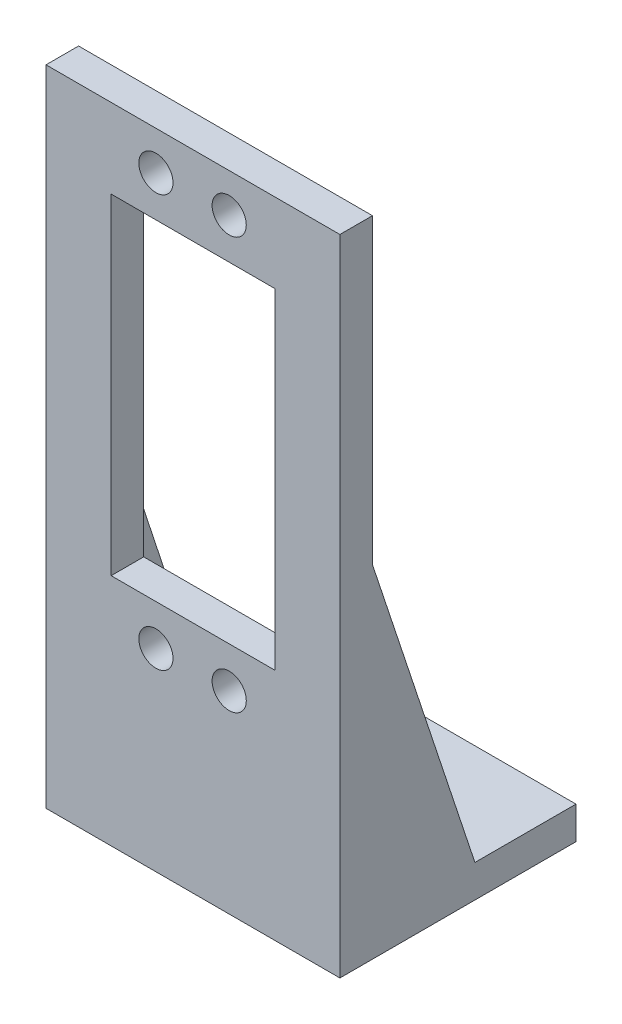
ISO-10303-21;
HEADER;
FILE_DESCRIPTION(('STEP AP214'),'2;1');
FILE_NAME('part.step','',(''),(''),'','','');
FILE_SCHEMA(('AUTOMOTIVE_DESIGN { 1 0 10303 214 1 1 1 1 }'));
ENDSEC;
DATA;
#1=APPLICATION_CONTEXT('core data for automotive mechanical design processes');
#2=APPLICATION_PROTOCOL_DEFINITION('international standard','automotive_design',2000,#1);
#3=PRODUCT_CONTEXT('',#1,'mechanical');
#4=PRODUCT('Part','Part','',(#3));
#5=PRODUCT_RELATED_PRODUCT_CATEGORY('part','',(#4));
#6=PRODUCT_DEFINITION_FORMATION('','',#4);
#7=PRODUCT_DEFINITION_CONTEXT('part definition',#1,'design');
#8=PRODUCT_DEFINITION('design','',#6,#7);
#9=PRODUCT_DEFINITION_SHAPE('','',#8);
#10=(LENGTH_UNIT() NAMED_UNIT(*) SI_UNIT(.MILLI.,.METRE.));
#11=(NAMED_UNIT(*) PLANE_ANGLE_UNIT() SI_UNIT($,.RADIAN.));
#12=(NAMED_UNIT(*) SI_UNIT($,.STERADIAN.) SOLID_ANGLE_UNIT());
#13=UNCERTAINTY_MEASURE_WITH_UNIT(LENGTH_MEASURE(1.E-05),#10,'distance_accuracy_value','');
#14=(GEOMETRIC_REPRESENTATION_CONTEXT(3) GLOBAL_UNCERTAINTY_ASSIGNED_CONTEXT((#13)) GLOBAL_UNIT_ASSIGNED_CONTEXT((#10,
#11,#12)) REPRESENTATION_CONTEXT('',''));
#15=CARTESIAN_POINT('',(0.,0.,0.));
#16=DIRECTION('',(0.,0.,1.));
#17=DIRECTION('',(1.,0.,0.));
#18=AXIS2_PLACEMENT_3D('',#15,#16,#17);
#19=CARTESIAN_POINT('',(0.,0.,4.));
#20=DIRECTION('',(0.,0.,-1.));
#21=DIRECTION('',(-1.,0.,0.));
#22=AXIS2_PLACEMENT_3D('',#19,#20,#21);
#23=PLANE('',#22);
#24=CARTESIAN_POINT('',(2.39999999999999,25.35,4.));
#25=DIRECTION('',(0.,0.,1.));
#26=DIRECTION('',(1.,0.,0.));
#27=AXIS2_PLACEMENT_3D('',#24,#25,#26);
#28=CIRCLE('',#27,2.1);
#29=CARTESIAN_POINT('',(4.49999999999999,25.35,4.));
#30=VERTEX_POINT('',#29);
#31=EDGE_CURVE('E344',#30,#30,#28,.T.);
#32=ORIENTED_EDGE('',*,*,#31,.F.);
#33=EDGE_LOOP('',(#32));
#34=FACE_BOUND('',#33,.T.);
#35=CARTESIAN_POINT('',(-6.60000000000001,-25.25,4.));
#36=DIRECTION('',(0.,0.,1.));
#37=DIRECTION('',(1.,0.,0.));
#38=AXIS2_PLACEMENT_3D('',#35,#36,#37);
#39=CIRCLE('',#38,2.1);
#40=CARTESIAN_POINT('',(-4.50000000000001,-25.25,4.));
#41=VERTEX_POINT('',#40);
#42=EDGE_CURVE('E345',#41,#41,#39,.T.);
#43=ORIENTED_EDGE('',*,*,#42,.F.);
#44=EDGE_LOOP('',(#43));
#45=FACE_BOUND('',#44,.T.);
#46=CARTESIAN_POINT('',(2.39999999999999,-25.25,4.));
#47=DIRECTION('',(0.,0.,1.));
#48=DIRECTION('',(1.,0.,0.));
#49=AXIS2_PLACEMENT_3D('',#46,#47,#48);
#50=CIRCLE('',#49,2.1);
#51=CARTESIAN_POINT('',(4.49999999999999,-25.25,4.));
#52=VERTEX_POINT('',#51);
#53=EDGE_CURVE('E349',#52,#52,#50,.T.);
#54=ORIENTED_EDGE('',*,*,#53,.F.);
#55=EDGE_LOOP('',(#54));
#56=FACE_BOUND('',#55,.T.);
#57=CARTESIAN_POINT('',(-6.60000000000001,25.35,4.));
#58=DIRECTION('',(0.,0.,1.));
#59=DIRECTION('',(1.,0.,0.));
#60=AXIS2_PLACEMENT_3D('',#57,#58,#59);
#61=CIRCLE('',#60,2.1);
#62=CARTESIAN_POINT('',(-4.50000000000001,25.35,4.));
#63=VERTEX_POINT('',#62);
#64=EDGE_CURVE('E291',#63,#63,#61,.T.);
#65=ORIENTED_EDGE('',*,*,#64,.F.);
#66=EDGE_LOOP('',(#65));
#67=FACE_BOUND('',#66,.T.);
#68=DIRECTION('',(0.,1.,0.));
#69=VECTOR('',#68,1.);
#70=CARTESIAN_POINT('',(16.,30.1,4.));
#71=LINE('',#70,#69);
#72=CARTESIAN_POINT('',(16.,-49.,4.));
#73=VERTEX_POINT('',#72);
#74=CARTESIAN_POINT('',(16.,30.1,4.));
#75=VERTEX_POINT('',#74);
#76=EDGE_CURVE('E155',#73,#75,#71,.T.);
#77=ORIENTED_EDGE('',*,*,#76,.T.);
#78=DIRECTION('',(-1.,0.,0.));
#79=VECTOR('',#78,1.);
#80=CARTESIAN_POINT('',(-20.1,30.1,4.));
#81=LINE('',#80,#79);
#82=CARTESIAN_POINT('',(-20.1,30.1,4.));
#83=VERTEX_POINT('',#82);
#84=EDGE_CURVE('E270',#75,#83,#81,.T.);
#85=ORIENTED_EDGE('',*,*,#84,.T.);
#86=DIRECTION('',(0.,-1.,0.));
#87=VECTOR('',#86,1.);
#88=CARTESIAN_POINT('',(-20.1,30.1,4.));
#89=LINE('',#88,#87);
#90=CARTESIAN_POINT('',(-20.1,-49.,4.));
#91=VERTEX_POINT('',#90);
#92=EDGE_CURVE('E273',#83,#91,#89,.T.);
#93=ORIENTED_EDGE('',*,*,#92,.T.);
#94=DIRECTION('',(1.,0.,0.));
#95=VECTOR('',#94,1.);
#96=CARTESIAN_POINT('',(-20.1,-49.,4.));
#97=LINE('',#96,#95);
#98=EDGE_CURVE('E186',#91,#73,#97,.T.);
#99=ORIENTED_EDGE('',*,*,#98,.T.);
#100=EDGE_LOOP('',(#77,#85,#93,#99));
#101=FACE_BOUND('',#100,.T.);
#102=DIRECTION('',(0.,1.,0.));
#103=VECTOR('',#102,1.);
#104=CARTESIAN_POINT('',(7.99999999999999,-20.25,4.));
#105=LINE('',#104,#103);
#106=CARTESIAN_POINT('',(7.99999999999999,-20.25,4.));
#107=VERTEX_POINT('',#106);
#108=CARTESIAN_POINT('',(7.99999999999999,20.35,4.));
#109=VERTEX_POINT('',#108);
#110=EDGE_CURVE('E224',#107,#109,#105,.T.);
#111=ORIENTED_EDGE('',*,*,#110,.F.);
#112=DIRECTION('',(1.,0.,0.));
#113=VECTOR('',#112,1.);
#114=CARTESIAN_POINT('',(-12.1,-20.25,4.));
#115=LINE('',#114,#113);
#116=CARTESIAN_POINT('',(-12.1,-20.25,4.));
#117=VERTEX_POINT('',#116);
#118=EDGE_CURVE('E235',#117,#107,#115,.T.);
#119=ORIENTED_EDGE('',*,*,#118,.F.);
#120=DIRECTION('',(0.,-1.,0.));
#121=VECTOR('',#120,1.);
#122=CARTESIAN_POINT('',(-12.1,-20.25,4.));
#123=LINE('',#122,#121);
#124=CARTESIAN_POINT('',(-12.1,20.35,4.));
#125=VERTEX_POINT('',#124);
#126=EDGE_CURVE('E231',#125,#117,#123,.T.);
#127=ORIENTED_EDGE('',*,*,#126,.F.);
#128=DIRECTION('',(-1.,0.,0.));
#129=VECTOR('',#128,1.);
#130=CARTESIAN_POINT('',(-12.1,20.35,4.));
#131=LINE('',#130,#129);
#132=EDGE_CURVE('E227',#109,#125,#131,.T.);
#133=ORIENTED_EDGE('',*,*,#132,.F.);
#134=EDGE_LOOP('',(#111,#119,#127,#133));
#135=FACE_BOUND('',#134,.T.);
#136=ADVANCED_FACE('F43',(#34,#45,#56,#67,#101,#135),#23,.F.);
#137=CARTESIAN_POINT('',(0.,0.,0.));
#138=DIRECTION('',(0.,0.,-1.));
#139=DIRECTION('',(-1.,0.,0.));
#140=AXIS2_PLACEMENT_3D('',#137,#138,#139);
#141=PLANE('',#140);
#142=CARTESIAN_POINT('',(2.39999999999999,25.35,0.));
#143=DIRECTION('',(0.,0.,-1.));
#144=DIRECTION('',(-1.,0.,0.));
#145=AXIS2_PLACEMENT_3D('',#142,#143,#144);
#146=CIRCLE('',#145,2.1);
#147=CARTESIAN_POINT('',(4.49999999999999,25.35,0.));
#148=VERTEX_POINT('',#147);
#149=EDGE_CURVE('E47',#148,#148,#146,.T.);
#150=ORIENTED_EDGE('',*,*,#149,.F.);
#151=EDGE_LOOP('',(#150));
#152=FACE_BOUND('',#151,.T.);
#153=CARTESIAN_POINT('',(-6.60000000000001,-25.25,0.));
#154=DIRECTION('',(0.,0.,-1.));
#155=DIRECTION('',(-1.,0.,0.));
#156=AXIS2_PLACEMENT_3D('',#153,#154,#155);
#157=CIRCLE('',#156,2.1);
#158=CARTESIAN_POINT('',(-4.50000000000001,-25.25,0.));
#159=VERTEX_POINT('',#158);
#160=EDGE_CURVE('E294',#159,#159,#157,.T.);
#161=ORIENTED_EDGE('',*,*,#160,.F.);
#162=EDGE_LOOP('',(#161));
#163=FACE_BOUND('',#162,.T.);
#164=CARTESIAN_POINT('',(2.39999999999999,-25.25,0.));
#165=DIRECTION('',(0.,0.,-1.));
#166=DIRECTION('',(-1.,0.,0.));
#167=AXIS2_PLACEMENT_3D('',#164,#165,#166);
#168=CIRCLE('',#167,2.1);
#169=CARTESIAN_POINT('',(4.49999999999999,-25.25,0.));
#170=VERTEX_POINT('',#169);
#171=EDGE_CURVE('E290',#170,#170,#168,.T.);
#172=ORIENTED_EDGE('',*,*,#171,.F.);
#173=EDGE_LOOP('',(#172));
#174=FACE_BOUND('',#173,.T.);
#175=CARTESIAN_POINT('',(-6.60000000000001,25.35,0.));
#176=DIRECTION('',(0.,0.,-1.));
#177=DIRECTION('',(-1.,0.,0.));
#178=AXIS2_PLACEMENT_3D('',#175,#176,#177);
#179=CIRCLE('',#178,2.1);
#180=CARTESIAN_POINT('',(-4.50000000000001,25.35,0.));
#181=VERTEX_POINT('',#180);
#182=EDGE_CURVE('E286',#181,#181,#179,.T.);
#183=ORIENTED_EDGE('',*,*,#182,.F.);
#184=EDGE_LOOP('',(#183));
#185=FACE_BOUND('',#184,.T.);
#186=DIRECTION('',(-1.,0.,0.));
#187=VECTOR('',#186,1.);
#188=CARTESIAN_POINT('',(-16.1,-7.00328961607334,0.));
#189=LINE('',#188,#187);
#190=CARTESIAN_POINT('',(-16.1,-7.00328961607334,0.));
#191=VERTEX_POINT('',#190);
#192=CARTESIAN_POINT('',(-20.1,-7.00328961607335,0.));
#193=VERTEX_POINT('',#192);
#194=EDGE_CURVE('E65',#191,#193,#189,.T.);
#195=ORIENTED_EDGE('',*,*,#194,.T.);
#196=DIRECTION('',(0.,-1.,0.));
#197=VECTOR('',#196,1.);
#198=CARTESIAN_POINT('',(-20.1,30.1,0.));
#199=LINE('',#198,#197);
#200=CARTESIAN_POINT('',(-20.1,30.1,0.));
#201=VERTEX_POINT('',#200);
#202=EDGE_CURVE('E156',#201,#193,#199,.T.);
#203=ORIENTED_EDGE('',*,*,#202,.F.);
#204=DIRECTION('',(-1.,0.,0.));
#205=VECTOR('',#204,1.);
#206=CARTESIAN_POINT('',(-20.1,30.1,0.));
#207=LINE('',#206,#205);
#208=CARTESIAN_POINT('',(16.,30.1,0.));
#209=VERTEX_POINT('',#208);
#210=EDGE_CURVE('E278',#209,#201,#207,.T.);
#211=ORIENTED_EDGE('',*,*,#210,.F.);
#212=DIRECTION('',(0.,1.,0.));
#213=VECTOR('',#212,1.);
#214=CARTESIAN_POINT('',(16.,30.1,0.));
#215=LINE('',#214,#213);
#216=CARTESIAN_POINT('',(16.,-7.03160161903525,0.));
#217=VERTEX_POINT('',#216);
#218=EDGE_CURVE('E266',#217,#209,#215,.T.);
#219=ORIENTED_EDGE('',*,*,#218,.F.);
#220=DIRECTION('',(1.,0.,0.));
#221=VECTOR('',#220,1.);
#222=CARTESIAN_POINT('',(12.,-7.03160161903525,0.));
#223=LINE('',#222,#221);
#224=CARTESIAN_POINT('',(12.,-7.03160161903525,0.));
#225=VERTEX_POINT('',#224);
#226=EDGE_CURVE('E170',#225,#217,#223,.T.);
#227=ORIENTED_EDGE('',*,*,#226,.F.);
#228=DIRECTION('',(0.,-1.,0.));
#229=VECTOR('',#228,1.);
#230=CARTESIAN_POINT('',(12.,-7.03160161903525,0.));
#231=LINE('',#230,#229);
#232=CARTESIAN_POINT('',(12.,-45.,0.));
#233=VERTEX_POINT('',#232);
#234=EDGE_CURVE('E161',#225,#233,#231,.T.);
#235=ORIENTED_EDGE('',*,*,#234,.T.);
#236=DIRECTION('',(1.,0.,0.));
#237=VECTOR('',#236,1.);
#238=CARTESIAN_POINT('',(16.,-45.,0.));
#239=LINE('',#238,#237);
#240=CARTESIAN_POINT('',(-16.1,-45.,0.));
#241=VERTEX_POINT('',#240);
#242=EDGE_CURVE('E146',#241,#233,#239,.T.);
#243=ORIENTED_EDGE('',*,*,#242,.F.);
#244=DIRECTION('',(0.,1.,0.));
#245=VECTOR('',#244,1.);
#246=CARTESIAN_POINT('',(-16.1,-7.00328961607334,0.));
#247=LINE('',#246,#245);
#248=EDGE_CURVE('E61',#241,#191,#247,.T.);
#249=ORIENTED_EDGE('',*,*,#248,.T.);
#250=EDGE_LOOP('',(#195,#203,#211,#219,#227,#235,#243,#249));
#251=FACE_BOUND('',#250,.T.);
#252=DIRECTION('',(1.,0.,0.));
#253=VECTOR('',#252,1.);
#254=CARTESIAN_POINT('',(-12.1,-20.25,0.));
#255=LINE('',#254,#253);
#256=CARTESIAN_POINT('',(-12.1,-20.25,0.));
#257=VERTEX_POINT('',#256);
#258=CARTESIAN_POINT('',(7.99999999999999,-20.25,0.));
#259=VERTEX_POINT('',#258);
#260=EDGE_CURVE('E228',#257,#259,#255,.T.);
#261=ORIENTED_EDGE('',*,*,#260,.T.);
#262=DIRECTION('',(0.,1.,0.));
#263=VECTOR('',#262,1.);
#264=CARTESIAN_POINT('',(7.99999999999999,-20.25,0.));
#265=LINE('',#264,#263);
#266=CARTESIAN_POINT('',(7.99999999999999,20.35,0.));
#267=VERTEX_POINT('',#266);
#268=EDGE_CURVE('E212',#259,#267,#265,.T.);
#269=ORIENTED_EDGE('',*,*,#268,.T.);
#270=DIRECTION('',(-1.,0.,0.));
#271=VECTOR('',#270,1.);
#272=CARTESIAN_POINT('',(-12.1,20.35,0.));
#273=LINE('',#272,#271);
#274=CARTESIAN_POINT('',(-12.1,20.35,0.));
#275=VERTEX_POINT('',#274);
#276=EDGE_CURVE('E242',#267,#275,#273,.T.);
#277=ORIENTED_EDGE('',*,*,#276,.T.);
#278=DIRECTION('',(0.,-1.,0.));
#279=VECTOR('',#278,1.);
#280=CARTESIAN_POINT('',(-12.1,-20.25,0.));
#281=LINE('',#280,#279);
#282=EDGE_CURVE('E246',#275,#257,#281,.T.);
#283=ORIENTED_EDGE('',*,*,#282,.T.);
#284=EDGE_LOOP('',(#261,#269,#277,#283));
#285=FACE_BOUND('',#284,.T.);
#286=ADVANCED_FACE('F167',(#152,#163,#174,#185,#251,#285),#141,.T.);
#287=CARTESIAN_POINT('',(16.,30.1,4.));
#288=DIRECTION('',(-1.,0.,0.));
#289=DIRECTION('',(0.,-1.,0.));
#290=AXIS2_PLACEMENT_3D('',#287,#288,#289);
#291=PLANE('',#290);
#292=DIRECTION('',(0.,0.949209959524119,0.314643373901661));
#293=VECTOR('',#292,1.);
#294=CARTESIAN_POINT('',(16.,-7.03160161903525,0.));
#295=LINE('',#294,#293);
#296=CARTESIAN_POINT('',(16.,-45.,-12.5857349560665));
#297=VERTEX_POINT('',#296);
#298=EDGE_CURVE('E172',#297,#217,#295,.T.);
#299=ORIENTED_EDGE('',*,*,#298,.T.);
#300=ORIENTED_EDGE('',*,*,#218,.T.);
#301=DIRECTION('',(0.,0.,-1.));
#302=VECTOR('',#301,1.);
#303=CARTESIAN_POINT('',(16.,30.1,4.));
#304=LINE('',#303,#302);
#305=EDGE_CURVE('E11',#75,#209,#304,.T.);
#306=ORIENTED_EDGE('',*,*,#305,.F.);
#307=ORIENTED_EDGE('',*,*,#76,.F.);
#308=DIRECTION('',(0.,0.,1.));
#309=VECTOR('',#308,1.);
#310=CARTESIAN_POINT('',(16.,-49.,-25.));
#311=LINE('',#310,#309);
#312=CARTESIAN_POINT('',(16.,-49.,-25.));
#313=VERTEX_POINT('',#312);
#314=EDGE_CURVE('E217',#313,#73,#311,.T.);
#315=ORIENTED_EDGE('',*,*,#314,.F.);
#316=DIRECTION('',(0.,1.,0.));
#317=VECTOR('',#316,1.);
#318=CARTESIAN_POINT('',(16.,-45.,-25.));
#319=LINE('',#318,#317);
#320=CARTESIAN_POINT('',(16.,-45.,-25.));
#321=VERTEX_POINT('',#320);
#322=EDGE_CURVE('E197',#313,#321,#319,.T.);
#323=ORIENTED_EDGE('',*,*,#322,.T.);
#324=DIRECTION('',(0.,0.,1.));
#325=VECTOR('',#324,1.);
#326=CARTESIAN_POINT('',(16.,-45.,-25.));
#327=LINE('',#326,#325);
#328=EDGE_CURVE('E213',#321,#297,#327,.T.);
#329=ORIENTED_EDGE('',*,*,#328,.T.);
#330=EDGE_LOOP('',(#299,#300,#306,#307,#315,#323,#329));
#331=FACE_BOUND('',#330,.T.);
#332=ADVANCED_FACE('F45',(#331),#291,.F.);
#333=CARTESIAN_POINT('',(-20.1,30.1,4.));
#334=DIRECTION('',(0.,-1.,0.));
#335=DIRECTION('',(0.,0.,-1.));
#336=AXIS2_PLACEMENT_3D('',#333,#334,#335);
#337=PLANE('',#336);
#338=ORIENTED_EDGE('',*,*,#210,.T.);
#339=DIRECTION('',(0.,0.,-1.));
#340=VECTOR('',#339,1.);
#341=CARTESIAN_POINT('',(-20.1,30.1,4.));
#342=LINE('',#341,#340);
#343=EDGE_CURVE('E53',#83,#201,#342,.T.);
#344=ORIENTED_EDGE('',*,*,#343,.F.);
#345=ORIENTED_EDGE('',*,*,#84,.F.);
#346=ORIENTED_EDGE('',*,*,#305,.T.);
#347=EDGE_LOOP('',(#338,#344,#345,#346));
#348=FACE_BOUND('',#347,.T.);
#349=ADVANCED_FACE('F401',(#348),#337,.F.);
#350=CARTESIAN_POINT('',(-20.1,30.1,4.));
#351=DIRECTION('',(1.,0.,0.));
#352=DIRECTION('',(0.,1.,0.));
#353=AXIS2_PLACEMENT_3D('',#350,#351,#352);
#354=PLANE('',#353);
#355=ORIENTED_EDGE('',*,*,#202,.T.);
#356=DIRECTION('',(0.,-0.949917759598167,-0.3125));
#357=VECTOR('',#356,1.);
#358=CARTESIAN_POINT('',(-20.1,-45.,-12.5));
#359=LINE('',#358,#357);
#360=CARTESIAN_POINT('',(-20.1,-45.,-12.5));
#361=VERTEX_POINT('',#360);
#362=EDGE_CURVE('E318',#193,#361,#359,.T.);
#363=ORIENTED_EDGE('',*,*,#362,.T.);
#364=DIRECTION('',(0.,0.,1.));
#365=VECTOR('',#364,1.);
#366=CARTESIAN_POINT('',(-20.1,-45.,-25.));
#367=LINE('',#366,#365);
#368=CARTESIAN_POINT('',(-20.1,-45.,-25.));
#369=VERTEX_POINT('',#368);
#370=EDGE_CURVE('E209',#369,#361,#367,.T.);
#371=ORIENTED_EDGE('',*,*,#370,.F.);
#372=DIRECTION('',(0.,-1.,0.));
#373=VECTOR('',#372,1.);
#374=CARTESIAN_POINT('',(-20.1,-45.,-25.));
#375=LINE('',#374,#373);
#376=CARTESIAN_POINT('',(-20.1,-49.,-25.));
#377=VERTEX_POINT('',#376);
#378=EDGE_CURVE('E189',#369,#377,#375,.T.);
#379=ORIENTED_EDGE('',*,*,#378,.T.);
#380=DIRECTION('',(0.,0.,1.));
#381=VECTOR('',#380,1.);
#382=CARTESIAN_POINT('',(-20.1,-49.,-25.));
#383=LINE('',#382,#381);
#384=EDGE_CURVE('E205',#377,#91,#383,.T.);
#385=ORIENTED_EDGE('',*,*,#384,.T.);
#386=ORIENTED_EDGE('',*,*,#92,.F.);
#387=ORIENTED_EDGE('',*,*,#343,.T.);
#388=EDGE_LOOP('',(#355,#363,#371,#379,#385,#386,#387));
#389=FACE_BOUND('',#388,.T.);
#390=ADVANCED_FACE('F395',(#389),#354,.F.);
#391=CARTESIAN_POINT('',(7.99999999999999,-20.25,4.));
#392=DIRECTION('',(-1.,0.,0.));
#393=DIRECTION('',(0.,-1.,0.));
#394=AXIS2_PLACEMENT_3D('',#391,#392,#393);
#395=PLANE('',#394);
#396=ORIENTED_EDGE('',*,*,#268,.F.);
#397=DIRECTION('',(0.,0.,-1.));
#398=VECTOR('',#397,1.);
#399=CARTESIAN_POINT('',(7.99999999999999,-20.25,4.));
#400=LINE('',#399,#398);
#401=EDGE_CURVE('E238',#107,#259,#400,.T.);
#402=ORIENTED_EDGE('',*,*,#401,.F.);
#403=ORIENTED_EDGE('',*,*,#110,.T.);
#404=DIRECTION('',(0.,0.,-1.));
#405=VECTOR('',#404,1.);
#406=CARTESIAN_POINT('',(7.99999999999999,20.35,4.));
#407=LINE('',#406,#405);
#408=EDGE_CURVE('E262',#109,#267,#407,.T.);
#409=ORIENTED_EDGE('',*,*,#408,.T.);
#410=EDGE_LOOP('',(#396,#402,#403,#409));
#411=FACE_BOUND('',#410,.T.);
#412=ADVANCED_FACE('F374',(#411),#395,.T.);
#413=CARTESIAN_POINT('',(-12.1,20.35,4.));
#414=DIRECTION('',(0.,-1.,0.));
#415=DIRECTION('',(0.,0.,-1.));
#416=AXIS2_PLACEMENT_3D('',#413,#414,#415);
#417=PLANE('',#416);
#418=ORIENTED_EDGE('',*,*,#276,.F.);
#419=ORIENTED_EDGE('',*,*,#408,.F.);
#420=ORIENTED_EDGE('',*,*,#132,.T.);
#421=DIRECTION('',(0.,0.,-1.));
#422=VECTOR('',#421,1.);
#423=CARTESIAN_POINT('',(-12.1,20.35,4.));
#424=LINE('',#423,#422);
#425=EDGE_CURVE('E259',#125,#275,#424,.T.);
#426=ORIENTED_EDGE('',*,*,#425,.T.);
#427=EDGE_LOOP('',(#418,#419,#420,#426));
#428=FACE_BOUND('',#427,.T.);
#429=ADVANCED_FACE('F376',(#428),#417,.T.);
#430=CARTESIAN_POINT('',(-12.1,-20.25,4.));
#431=DIRECTION('',(1.,0.,0.));
#432=DIRECTION('',(0.,0.,-1.));
#433=AXIS2_PLACEMENT_3D('',#430,#431,#432);
#434=PLANE('',#433);
#435=ORIENTED_EDGE('',*,*,#282,.F.);
#436=ORIENTED_EDGE('',*,*,#425,.F.);
#437=ORIENTED_EDGE('',*,*,#126,.T.);
#438=DIRECTION('',(0.,0.,-1.));
#439=VECTOR('',#438,1.);
#440=CARTESIAN_POINT('',(-12.1,-20.25,4.));
#441=LINE('',#440,#439);
#442=EDGE_CURVE('E256',#117,#257,#441,.T.);
#443=ORIENTED_EDGE('',*,*,#442,.T.);
#444=EDGE_LOOP('',(#435,#436,#437,#443));
#445=FACE_BOUND('',#444,.T.);
#446=ADVANCED_FACE('F383',(#445),#434,.T.);
#447=CARTESIAN_POINT('',(-12.1,-20.25,4.));
#448=DIRECTION('',(0.,1.,0.));
#449=DIRECTION('',(0.,0.,1.));
#450=AXIS2_PLACEMENT_3D('',#447,#448,#449);
#451=PLANE('',#450);
#452=ORIENTED_EDGE('',*,*,#260,.F.);
#453=ORIENTED_EDGE('',*,*,#442,.F.);
#454=ORIENTED_EDGE('',*,*,#118,.T.);
#455=ORIENTED_EDGE('',*,*,#401,.T.);
#456=EDGE_LOOP('',(#452,#453,#454,#455));
#457=FACE_BOUND('',#456,.T.);
#458=ADVANCED_FACE('F381',(#457),#451,.T.);
#459=CARTESIAN_POINT('',(-20.1,-45.,-25.));
#460=DIRECTION('',(0.,1.,0.));
#461=DIRECTION('',(0.,0.,1.));
#462=AXIS2_PLACEMENT_3D('',#459,#460,#461);
#463=PLANE('',#462);
#464=CARTESIAN_POINT('',(2.57967865999744,-45.,-17.1225461380307));
#465=DIRECTION('',(0.,1.,0.));
#466=DIRECTION('',(0.,0.,1.));
#467=AXIS2_PLACEMENT_3D('',#464,#465,#466);
#468=CIRCLE('',#467,2.);
#469=CARTESIAN_POINT('',(2.57967865999744,-45.,-15.1225461380307));
#470=VERTEX_POINT('',#469);
#471=EDGE_CURVE('E312',#470,#470,#468,.T.);
#472=ORIENTED_EDGE('',*,*,#471,.F.);
#473=EDGE_LOOP('',(#472));
#474=FACE_BOUND('',#473,.T.);
#475=CARTESIAN_POINT('',(-6.55154743850848,-45.,-7.93522934416472));
#476=DIRECTION('',(0.,1.,0.));
#477=DIRECTION('',(0.,0.,1.));
#478=AXIS2_PLACEMENT_3D('',#475,#476,#477);
#479=CIRCLE('',#478,2.);
#480=CARTESIAN_POINT('',(-6.55154743850848,-45.,-5.93522934416472));
#481=VERTEX_POINT('',#480);
#482=EDGE_CURVE('E306',#481,#481,#479,.T.);
#483=ORIENTED_EDGE('',*,*,#482,.F.);
#484=EDGE_LOOP('',(#483));
#485=FACE_BOUND('',#484,.T.);
#486=DIRECTION('',(-1.,0.,0.));
#487=VECTOR('',#486,1.);
#488=CARTESIAN_POINT('',(-16.1,-45.,-12.5));
#489=LINE('',#488,#487);
#490=CARTESIAN_POINT('',(-16.1,-45.,-12.5));
#491=VERTEX_POINT('',#490);
#492=EDGE_CURVE('E176',#491,#361,#489,.T.);
#493=ORIENTED_EDGE('',*,*,#492,.F.);
#494=DIRECTION('',(0.,0.,1.));
#495=VECTOR('',#494,1.);
#496=CARTESIAN_POINT('',(-16.1,-45.,0.));
#497=LINE('',#496,#495);
#498=EDGE_CURVE('E152',#491,#241,#497,.T.);
#499=ORIENTED_EDGE('',*,*,#498,.T.);
#500=ORIENTED_EDGE('',*,*,#242,.T.);
#501=DIRECTION('',(0.,0.,-1.));
#502=VECTOR('',#501,1.);
#503=CARTESIAN_POINT('',(12.,-45.,0.));
#504=LINE('',#503,#502);
#505=CARTESIAN_POINT('',(12.,-45.,-12.5857349560665));
#506=VERTEX_POINT('',#505);
#507=EDGE_CURVE('E150',#233,#506,#504,.T.);
#508=ORIENTED_EDGE('',*,*,#507,.T.);
#509=DIRECTION('',(1.,0.,0.));
#510=VECTOR('',#509,1.);
#511=CARTESIAN_POINT('',(12.,-45.,-12.5857349560665));
#512=LINE('',#511,#510);
#513=EDGE_CURVE('E182',#506,#297,#512,.T.);
#514=ORIENTED_EDGE('',*,*,#513,.T.);
#515=ORIENTED_EDGE('',*,*,#328,.F.);
#516=DIRECTION('',(-1.,0.,0.));
#517=VECTOR('',#516,1.);
#518=CARTESIAN_POINT('',(-20.1,-45.,-25.));
#519=LINE('',#518,#517);
#520=EDGE_CURVE('E201',#321,#369,#519,.T.);
#521=ORIENTED_EDGE('',*,*,#520,.T.);
#522=ORIENTED_EDGE('',*,*,#370,.T.);
#523=EDGE_LOOP('',(#493,#499,#500,#508,#514,#515,#521,#522));
#524=FACE_BOUND('',#523,.T.);
#525=ADVANCED_FACE('F148',(#474,#485,#524),#463,.T.);
#526=CARTESIAN_POINT('',(-20.1,-49.,-25.));
#527=DIRECTION('',(0.,-1.,0.));
#528=DIRECTION('',(0.,0.,-1.));
#529=AXIS2_PLACEMENT_3D('',#526,#527,#528);
#530=PLANE('',#529);
#531=CARTESIAN_POINT('',(2.57967865999744,-49.,-17.1225461380307));
#532=DIRECTION('',(0.,1.,0.));
#533=DIRECTION('',(0.,0.,1.));
#534=AXIS2_PLACEMENT_3D('',#531,#532,#533);
#535=CIRCLE('',#534,2.);
#536=CARTESIAN_POINT('',(2.57967865999744,-49.,-15.1225461380307));
#537=VERTEX_POINT('',#536);
#538=EDGE_CURVE('E327',#537,#537,#535,.T.);
#539=ORIENTED_EDGE('',*,*,#538,.T.);
#540=EDGE_LOOP('',(#539));
#541=FACE_BOUND('',#540,.T.);
#542=CARTESIAN_POINT('',(-6.55154743850848,-49.,-7.93522934416472));
#543=DIRECTION('',(0.,1.,0.));
#544=DIRECTION('',(0.,0.,1.));
#545=AXIS2_PLACEMENT_3D('',#542,#543,#544);
#546=CIRCLE('',#545,2.);
#547=CARTESIAN_POINT('',(-6.55154743850848,-49.,-5.93522934416472));
#548=VERTEX_POINT('',#547);
#549=EDGE_CURVE('E301',#548,#548,#546,.T.);
#550=ORIENTED_EDGE('',*,*,#549,.T.);
#551=EDGE_LOOP('',(#550));
#552=FACE_BOUND('',#551,.T.);
#553=ORIENTED_EDGE('',*,*,#98,.F.);
#554=ORIENTED_EDGE('',*,*,#384,.F.);
#555=DIRECTION('',(1.,0.,0.));
#556=VECTOR('',#555,1.);
#557=CARTESIAN_POINT('',(-20.1,-49.,-25.));
#558=LINE('',#557,#556);
#559=EDGE_CURVE('E193',#377,#313,#558,.T.);
#560=ORIENTED_EDGE('',*,*,#559,.T.);
#561=ORIENTED_EDGE('',*,*,#314,.T.);
#562=EDGE_LOOP('',(#553,#554,#560,#561));
#563=FACE_BOUND('',#562,.T.);
#564=ADVANCED_FACE('F414',(#541,#552,#563),#530,.T.);
#565=CARTESIAN_POINT('',(0.,0.,-25.));
#566=DIRECTION('',(0.,0.,1.));
#567=DIRECTION('',(1.,0.,0.));
#568=AXIS2_PLACEMENT_3D('',#565,#566,#567);
#569=PLANE('',#568);
#570=ORIENTED_EDGE('',*,*,#378,.F.);
#571=ORIENTED_EDGE('',*,*,#520,.F.);
#572=ORIENTED_EDGE('',*,*,#322,.F.);
#573=ORIENTED_EDGE('',*,*,#559,.F.);
#574=EDGE_LOOP('',(#570,#571,#572,#573));
#575=FACE_BOUND('',#574,.T.);
#576=ADVANCED_FACE('F420',(#575),#569,.F.);
#577=CARTESIAN_POINT('',(12.,-7.03160161903525,0.));
#578=DIRECTION('',(0.,0.314643373901661,-0.949209959524119));
#579=DIRECTION('',(0.,0.949209959524119,0.314643373901661));
#580=AXIS2_PLACEMENT_3D('',#577,#578,#579);
#581=PLANE('',#580);
#582=ORIENTED_EDGE('',*,*,#298,.F.);
#583=ORIENTED_EDGE('',*,*,#513,.F.);
#584=DIRECTION('',(0.,0.949209959524119,0.314643373901661));
#585=VECTOR('',#584,1.);
#586=CARTESIAN_POINT('',(12.,-7.03160161903525,0.));
#587=LINE('',#586,#585);
#588=EDGE_CURVE('E163',#506,#225,#587,.T.);
#589=ORIENTED_EDGE('',*,*,#588,.T.);
#590=ORIENTED_EDGE('',*,*,#226,.T.);
#591=EDGE_LOOP('',(#582,#583,#589,#590));
#592=FACE_BOUND('',#591,.T.);
#593=ADVANCED_FACE('F422',(#592),#581,.T.);
#594=CARTESIAN_POINT('',(12.,0.,0.));
#595=DIRECTION('',(1.,0.,0.));
#596=DIRECTION('',(0.,1.,0.));
#597=AXIS2_PLACEMENT_3D('',#594,#595,#596);
#598=PLANE('',#597);
#599=ORIENTED_EDGE('',*,*,#234,.F.);
#600=ORIENTED_EDGE('',*,*,#588,.F.);
#601=ORIENTED_EDGE('',*,*,#507,.F.);
#602=EDGE_LOOP('',(#599,#600,#601));
#603=FACE_BOUND('',#602,.T.);
#604=ADVANCED_FACE('F160',(#603),#598,.F.);
#605=CARTESIAN_POINT('',(-16.1,-45.,-12.5));
#606=DIRECTION('',(0.,0.3125,-0.949917759598167));
#607=DIRECTION('',(0.,0.949917759598167,0.3125));
#608=AXIS2_PLACEMENT_3D('',#605,#606,#607);
#609=PLANE('',#608);
#610=ORIENTED_EDGE('',*,*,#362,.F.);
#611=ORIENTED_EDGE('',*,*,#194,.F.);
#612=DIRECTION('',(0.,-0.949917759598167,-0.3125));
#613=VECTOR('',#612,1.);
#614=CARTESIAN_POINT('',(-16.1,-45.,-12.5));
#615=LINE('',#614,#613);
#616=EDGE_CURVE('E321',#191,#491,#615,.T.);
#617=ORIENTED_EDGE('',*,*,#616,.T.);
#618=ORIENTED_EDGE('',*,*,#492,.T.);
#619=EDGE_LOOP('',(#610,#611,#617,#618));
#620=FACE_BOUND('',#619,.T.);
#621=ADVANCED_FACE('F429',(#620),#609,.T.);
#622=CARTESIAN_POINT('',(-16.1,0.,0.));
#623=DIRECTION('',(-1.,0.,0.));
#624=DIRECTION('',(0.,0.,1.));
#625=AXIS2_PLACEMENT_3D('',#622,#623,#624);
#626=PLANE('',#625);
#627=ORIENTED_EDGE('',*,*,#498,.F.);
#628=ORIENTED_EDGE('',*,*,#616,.F.);
#629=ORIENTED_EDGE('',*,*,#248,.F.);
#630=EDGE_LOOP('',(#627,#628,#629));
#631=FACE_BOUND('',#630,.T.);
#632=ADVANCED_FACE('F453',(#631),#626,.F.);
#633=CARTESIAN_POINT('',(-6.55154743850848,-49.,-7.93522934416472));
#634=DIRECTION('',(0.,1.,0.));
#635=DIRECTION('',(0.,0.,1.));
#636=AXIS2_PLACEMENT_3D('',#633,#634,#635);
#637=CYLINDRICAL_SURFACE('',#636,2.);
#638=ORIENTED_EDGE('',*,*,#549,.F.);
#639=EDGE_LOOP('',(#638));
#640=FACE_BOUND('',#639,.T.);
#641=ORIENTED_EDGE('',*,*,#482,.T.);
#642=EDGE_LOOP('',(#641));
#643=FACE_BOUND('',#642,.T.);
#644=ADVANCED_FACE('F445',(#640,#643),#637,.F.);
#645=CARTESIAN_POINT('',(2.57967865999744,-49.,-17.1225461380307));
#646=DIRECTION('',(0.,1.,0.));
#647=DIRECTION('',(0.,0.,1.));
#648=AXIS2_PLACEMENT_3D('',#645,#646,#647);
#649=CYLINDRICAL_SURFACE('',#648,2.);
#650=ORIENTED_EDGE('',*,*,#538,.F.);
#651=EDGE_LOOP('',(#650));
#652=FACE_BOUND('',#651,.T.);
#653=ORIENTED_EDGE('',*,*,#471,.T.);
#654=EDGE_LOOP('',(#653));
#655=FACE_BOUND('',#654,.T.);
#656=ADVANCED_FACE('F442',(#652,#655),#649,.F.);
#657=CARTESIAN_POINT('',(-6.60000000000001,25.35,-25.));
#658=DIRECTION('',(0.,0.,1.));
#659=DIRECTION('',(1.,0.,0.));
#660=AXIS2_PLACEMENT_3D('',#657,#658,#659);
#661=CYLINDRICAL_SURFACE('',#660,2.1);
#662=CARTESIAN_POINT('',(-4.50000000000001,25.35,0.));
#663=CARTESIAN_POINT('',(-4.50000000000001,25.35,0.0416666666666701));
#664=CARTESIAN_POINT('',(-4.50000000000001,25.35,0.0833333333333369));
#665=CARTESIAN_POINT('',(-4.50000000000001,25.35,0.16666666666667));
#666=CARTESIAN_POINT('',(-4.50000000000001,25.35,0.208333333333337));
#667=CARTESIAN_POINT('',(-4.50000000000001,25.35,0.29166666666667));
#668=CARTESIAN_POINT('',(-4.50000000000001,25.35,0.333333333333337));
#669=CARTESIAN_POINT('',(-4.50000000000001,25.35,0.416666666666671));
#670=CARTESIAN_POINT('',(-4.50000000000001,25.35,0.458333333333337));
#671=CARTESIAN_POINT('',(-4.50000000000001,25.35,0.541666666666671));
#672=CARTESIAN_POINT('',(-4.50000000000001,25.35,0.583333333333337));
#673=CARTESIAN_POINT('',(-4.50000000000001,25.35,0.666666666666671));
#674=CARTESIAN_POINT('',(-4.50000000000001,25.35,0.708333333333337));
#675=CARTESIAN_POINT('',(-4.50000000000001,25.35,0.791666666666671));
#676=CARTESIAN_POINT('',(-4.50000000000001,25.35,0.833333333333337));
#677=CARTESIAN_POINT('',(-4.50000000000001,25.35,0.916666666666671));
#678=CARTESIAN_POINT('',(-4.50000000000001,25.35,0.958333333333338));
#679=CARTESIAN_POINT('',(-4.50000000000001,25.35,1.04166666666667));
#680=CARTESIAN_POINT('',(-4.50000000000001,25.35,1.08333333333334));
#681=CARTESIAN_POINT('',(-4.50000000000001,25.35,1.16666666666667));
#682=CARTESIAN_POINT('',(-4.50000000000001,25.35,1.20833333333333));
#683=CARTESIAN_POINT('',(-4.50000000000001,25.35,1.29166666666667));
#684=CARTESIAN_POINT('',(-4.50000000000001,25.35,1.33333333333333));
#685=CARTESIAN_POINT('',(-4.50000000000001,25.35,1.41666666666667));
#686=CARTESIAN_POINT('',(-4.50000000000001,25.35,1.45833333333333));
#687=CARTESIAN_POINT('',(-4.50000000000001,25.35,1.54166666666667));
#688=CARTESIAN_POINT('',(-4.50000000000001,25.35,1.58333333333333));
#689=CARTESIAN_POINT('',(-4.50000000000001,25.35,1.66666666666667));
#690=CARTESIAN_POINT('',(-4.50000000000001,25.35,1.70833333333333));
#691=CARTESIAN_POINT('',(-4.50000000000001,25.35,1.79166666666667));
#692=CARTESIAN_POINT('',(-4.50000000000001,25.35,1.83333333333334));
#693=CARTESIAN_POINT('',(-4.50000000000001,25.35,1.91666666666667));
#694=CARTESIAN_POINT('',(-4.50000000000001,25.35,1.95833333333334));
#695=CARTESIAN_POINT('',(-4.50000000000001,25.35,2.04166666666667));
#696=CARTESIAN_POINT('',(-4.50000000000001,25.35,2.08333333333334));
#697=CARTESIAN_POINT('',(-4.50000000000001,25.35,2.16666666666667));
#698=CARTESIAN_POINT('',(-4.50000000000001,25.35,2.20833333333334));
#699=CARTESIAN_POINT('',(-4.50000000000001,25.35,2.29166666666667));
#700=CARTESIAN_POINT('',(-4.50000000000001,25.35,2.33333333333334));
#701=CARTESIAN_POINT('',(-4.50000000000001,25.35,2.41666666666667));
#702=CARTESIAN_POINT('',(-4.50000000000001,25.35,2.45833333333334));
#703=CARTESIAN_POINT('',(-4.50000000000001,25.35,2.54166666666667));
#704=CARTESIAN_POINT('',(-4.50000000000001,25.35,2.58333333333334));
#705=CARTESIAN_POINT('',(-4.50000000000001,25.35,2.66666666666667));
#706=CARTESIAN_POINT('',(-4.50000000000001,25.35,2.70833333333334));
#707=CARTESIAN_POINT('',(-4.50000000000001,25.35,2.79166666666667));
#708=CARTESIAN_POINT('',(-4.50000000000001,25.35,2.83333333333333));
#709=CARTESIAN_POINT('',(-4.50000000000001,25.35,2.91666666666667));
#710=CARTESIAN_POINT('',(-4.50000000000001,25.35,2.95833333333333));
#711=CARTESIAN_POINT('',(-4.50000000000001,25.35,3.04166666666667));
#712=CARTESIAN_POINT('',(-4.50000000000001,25.35,3.08333333333333));
#713=CARTESIAN_POINT('',(-4.50000000000001,25.35,3.16666666666667));
#714=CARTESIAN_POINT('',(-4.50000000000001,25.35,3.20833333333333));
#715=CARTESIAN_POINT('',(-4.50000000000001,25.35,3.29166666666667));
#716=CARTESIAN_POINT('',(-4.50000000000001,25.35,3.33333333333333));
#717=CARTESIAN_POINT('',(-4.50000000000001,25.35,3.41666666666667));
#718=CARTESIAN_POINT('',(-4.50000000000001,25.35,3.45833333333333));
#719=CARTESIAN_POINT('',(-4.50000000000001,25.35,3.54166666666667));
#720=CARTESIAN_POINT('',(-4.50000000000001,25.35,3.58333333333333));
#721=CARTESIAN_POINT('',(-4.50000000000001,25.35,3.66666666666667));
#722=CARTESIAN_POINT('',(-4.50000000000001,25.35,3.70833333333333));
#723=CARTESIAN_POINT('',(-4.50000000000001,25.35,3.79166666666667));
#724=CARTESIAN_POINT('',(-4.50000000000001,25.35,3.83333333333333));
#725=CARTESIAN_POINT('',(-4.50000000000001,25.35,3.91666666666667));
#726=CARTESIAN_POINT('',(-4.50000000000001,25.35,3.95833333333333));
#727=CARTESIAN_POINT('',(-4.50000000000001,25.35,4.));
#728=B_SPLINE_CURVE_WITH_KNOTS('',3,(#662,#663,#664,#665,#666,#667,#668,#669,#670,#671,#672,
#673,#674,#675,#676,#677,#678,#679,#680,#681,#682,#683,#684,#685,#686,#687,#688,#689,#690,#691,
#692,#693,#694,#695,#696,#697,#698,#699,#700,#701,#702,#703,#704,#705,#706,#707,#708,#709,#710,
#711,#712,#713,#714,#715,#716,#717,#718,#719,#720,#721,#722,#723,#724,#725,#726,#727),
.UNSPECIFIED.,.F.,.F.,(4,2,2,2,2,2,2,2,2,2,2,2,2,2,2,2,2,2,2,2,2,2,2,2,2,2,2,2,2,2,2,2,4),(0.,
0.125,0.25,0.375,0.5,0.625000000000001,0.750000000000001,0.875000000000001,1.,1.125,1.25,1.375,
1.5,1.625,1.75,1.875,2.,2.125,2.25,2.375,2.5,2.625,2.75,2.875,3.,3.125,3.25,3.375,3.5,3.625,
3.75,3.875,4.),.UNSPECIFIED.);
#729=EDGE_CURVE('BSEAM444',#181,#63,#728,.T.);
#730=ORIENTED_EDGE('',*,*,#182,.T.);
#731=ORIENTED_EDGE('',*,*,#64,.T.);
#732=ORIENTED_EDGE('',*,*,#729,.T.);
#733=ORIENTED_EDGE('',*,*,#729,.F.);
#734=EDGE_LOOP('',(#730,#732,#731,#733));
#735=FACE_BOUND('',#734,.T.);
#736=ADVANCED_FACE('F444',(#735),#661,.F.);
#737=CARTESIAN_POINT('',(2.39999999999999,-25.25,-25.));
#738=DIRECTION('',(0.,0.,1.));
#739=DIRECTION('',(1.,0.,0.));
#740=AXIS2_PLACEMENT_3D('',#737,#738,#739);
#741=CYLINDRICAL_SURFACE('',#740,2.1);
#742=CARTESIAN_POINT('',(4.49999999999999,-25.25,0.));
#743=CARTESIAN_POINT('',(4.49999999999999,-25.25,0.0416666666666701));
#744=CARTESIAN_POINT('',(4.49999999999999,-25.25,0.0833333333333369));
#745=CARTESIAN_POINT('',(4.49999999999999,-25.25,0.16666666666667));
#746=CARTESIAN_POINT('',(4.49999999999999,-25.25,0.208333333333337));
#747=CARTESIAN_POINT('',(4.49999999999999,-25.25,0.29166666666667));
#748=CARTESIAN_POINT('',(4.49999999999999,-25.25,0.333333333333337));
#749=CARTESIAN_POINT('',(4.49999999999999,-25.25,0.416666666666671));
#750=CARTESIAN_POINT('',(4.49999999999999,-25.25,0.458333333333337));
#751=CARTESIAN_POINT('',(4.49999999999999,-25.25,0.541666666666671));
#752=CARTESIAN_POINT('',(4.49999999999999,-25.25,0.583333333333337));
#753=CARTESIAN_POINT('',(4.49999999999999,-25.25,0.666666666666671));
#754=CARTESIAN_POINT('',(4.49999999999999,-25.25,0.708333333333337));
#755=CARTESIAN_POINT('',(4.49999999999999,-25.25,0.791666666666671));
#756=CARTESIAN_POINT('',(4.49999999999999,-25.25,0.833333333333337));
#757=CARTESIAN_POINT('',(4.49999999999999,-25.25,0.916666666666671));
#758=CARTESIAN_POINT('',(4.49999999999999,-25.25,0.958333333333338));
#759=CARTESIAN_POINT('',(4.49999999999999,-25.25,1.04166666666667));
#760=CARTESIAN_POINT('',(4.49999999999999,-25.25,1.08333333333334));
#761=CARTESIAN_POINT('',(4.49999999999999,-25.25,1.16666666666667));
#762=CARTESIAN_POINT('',(4.49999999999999,-25.25,1.20833333333333));
#763=CARTESIAN_POINT('',(4.49999999999999,-25.25,1.29166666666667));
#764=CARTESIAN_POINT('',(4.49999999999999,-25.25,1.33333333333333));
#765=CARTESIAN_POINT('',(4.49999999999999,-25.25,1.41666666666667));
#766=CARTESIAN_POINT('',(4.49999999999999,-25.25,1.45833333333333));
#767=CARTESIAN_POINT('',(4.49999999999999,-25.25,1.54166666666667));
#768=CARTESIAN_POINT('',(4.49999999999999,-25.25,1.58333333333333));
#769=CARTESIAN_POINT('',(4.49999999999999,-25.25,1.66666666666667));
#770=CARTESIAN_POINT('',(4.49999999999999,-25.25,1.70833333333333));
#771=CARTESIAN_POINT('',(4.49999999999999,-25.25,1.79166666666667));
#772=CARTESIAN_POINT('',(4.49999999999999,-25.25,1.83333333333334));
#773=CARTESIAN_POINT('',(4.49999999999999,-25.25,1.91666666666667));
#774=CARTESIAN_POINT('',(4.49999999999999,-25.25,1.95833333333334));
#775=CARTESIAN_POINT('',(4.49999999999999,-25.25,2.04166666666667));
#776=CARTESIAN_POINT('',(4.49999999999999,-25.25,2.08333333333334));
#777=CARTESIAN_POINT('',(4.49999999999999,-25.25,2.16666666666667));
#778=CARTESIAN_POINT('',(4.49999999999999,-25.25,2.20833333333334));
#779=CARTESIAN_POINT('',(4.49999999999999,-25.25,2.29166666666667));
#780=CARTESIAN_POINT('',(4.49999999999999,-25.25,2.33333333333334));
#781=CARTESIAN_POINT('',(4.49999999999999,-25.25,2.41666666666667));
#782=CARTESIAN_POINT('',(4.49999999999999,-25.25,2.45833333333334));
#783=CARTESIAN_POINT('',(4.49999999999999,-25.25,2.54166666666667));
#784=CARTESIAN_POINT('',(4.49999999999999,-25.25,2.58333333333334));
#785=CARTESIAN_POINT('',(4.49999999999999,-25.25,2.66666666666667));
#786=CARTESIAN_POINT('',(4.49999999999999,-25.25,2.70833333333334));
#787=CARTESIAN_POINT('',(4.49999999999999,-25.25,2.79166666666667));
#788=CARTESIAN_POINT('',(4.49999999999999,-25.25,2.83333333333333));
#789=CARTESIAN_POINT('',(4.49999999999999,-25.25,2.91666666666667));
#790=CARTESIAN_POINT('',(4.49999999999999,-25.25,2.95833333333333));
#791=CARTESIAN_POINT('',(4.49999999999999,-25.25,3.04166666666667));
#792=CARTESIAN_POINT('',(4.49999999999999,-25.25,3.08333333333333));
#793=CARTESIAN_POINT('',(4.49999999999999,-25.25,3.16666666666667));
#794=CARTESIAN_POINT('',(4.49999999999999,-25.25,3.20833333333333));
#795=CARTESIAN_POINT('',(4.49999999999999,-25.25,3.29166666666667));
#796=CARTESIAN_POINT('',(4.49999999999999,-25.25,3.33333333333333));
#797=CARTESIAN_POINT('',(4.49999999999999,-25.25,3.41666666666667));
#798=CARTESIAN_POINT('',(4.49999999999999,-25.25,3.45833333333333));
#799=CARTESIAN_POINT('',(4.49999999999999,-25.25,3.54166666666667));
#800=CARTESIAN_POINT('',(4.49999999999999,-25.25,3.58333333333333));
#801=CARTESIAN_POINT('',(4.49999999999999,-25.25,3.66666666666667));
#802=CARTESIAN_POINT('',(4.49999999999999,-25.25,3.70833333333333));
#803=CARTESIAN_POINT('',(4.49999999999999,-25.25,3.79166666666667));
#804=CARTESIAN_POINT('',(4.49999999999999,-25.25,3.83333333333333));
#805=CARTESIAN_POINT('',(4.49999999999999,-25.25,3.91666666666667));
#806=CARTESIAN_POINT('',(4.49999999999999,-25.25,3.95833333333333));
#807=CARTESIAN_POINT('',(4.49999999999999,-25.25,4.));
#808=B_SPLINE_CURVE_WITH_KNOTS('',3,(#742,#743,#744,#745,#746,#747,#748,#749,#750,#751,#752,
#753,#754,#755,#756,#757,#758,#759,#760,#761,#762,#763,#764,#765,#766,#767,#768,#769,#770,#771,
#772,#773,#774,#775,#776,#777,#778,#779,#780,#781,#782,#783,#784,#785,#786,#787,#788,#789,#790,
#791,#792,#793,#794,#795,#796,#797,#798,#799,#800,#801,#802,#803,#804,#805,#806,#807),
.UNSPECIFIED.,.F.,.F.,(4,2,2,2,2,2,2,2,2,2,2,2,2,2,2,2,2,2,2,2,2,2,2,2,2,2,2,2,2,2,2,2,4),(0.,
0.125,0.25,0.375,0.5,0.625000000000001,0.750000000000001,0.875000000000001,1.,1.125,1.25,1.375,
1.5,1.625,1.75,1.875,2.,2.125,2.25,2.375,2.5,2.625,2.75,2.875,3.,3.125,3.25,3.375,3.5,3.625,
3.75,3.875,4.),.UNSPECIFIED.);
#809=EDGE_CURVE('BSEAM357',#170,#52,#808,.T.);
#810=ORIENTED_EDGE('',*,*,#171,.T.);
#811=ORIENTED_EDGE('',*,*,#53,.T.);
#812=ORIENTED_EDGE('',*,*,#809,.T.);
#813=ORIENTED_EDGE('',*,*,#809,.F.);
#814=EDGE_LOOP('',(#810,#812,#811,#813));
#815=FACE_BOUND('',#814,.T.);
#816=ADVANCED_FACE('F357',(#815),#741,.F.);
#817=CARTESIAN_POINT('',(-6.60000000000001,-25.25,-25.));
#818=DIRECTION('',(0.,0.,1.));
#819=DIRECTION('',(1.,0.,0.));
#820=AXIS2_PLACEMENT_3D('',#817,#818,#819);
#821=CYLINDRICAL_SURFACE('',#820,2.1);
#822=CARTESIAN_POINT('',(-4.50000000000001,-25.25,0.));
#823=CARTESIAN_POINT('',(-4.50000000000001,-25.25,0.0416666666666701));
#824=CARTESIAN_POINT('',(-4.50000000000001,-25.25,0.0833333333333369));
#825=CARTESIAN_POINT('',(-4.50000000000001,-25.25,0.16666666666667));
#826=CARTESIAN_POINT('',(-4.50000000000001,-25.25,0.208333333333337));
#827=CARTESIAN_POINT('',(-4.50000000000001,-25.25,0.29166666666667));
#828=CARTESIAN_POINT('',(-4.50000000000001,-25.25,0.333333333333337));
#829=CARTESIAN_POINT('',(-4.50000000000001,-25.25,0.416666666666671));
#830=CARTESIAN_POINT('',(-4.50000000000001,-25.25,0.458333333333337));
#831=CARTESIAN_POINT('',(-4.50000000000001,-25.25,0.541666666666671));
#832=CARTESIAN_POINT('',(-4.50000000000001,-25.25,0.583333333333337));
#833=CARTESIAN_POINT('',(-4.50000000000001,-25.25,0.666666666666671));
#834=CARTESIAN_POINT('',(-4.50000000000001,-25.25,0.708333333333337));
#835=CARTESIAN_POINT('',(-4.50000000000001,-25.25,0.791666666666671));
#836=CARTESIAN_POINT('',(-4.50000000000001,-25.25,0.833333333333337));
#837=CARTESIAN_POINT('',(-4.50000000000001,-25.25,0.916666666666671));
#838=CARTESIAN_POINT('',(-4.50000000000001,-25.25,0.958333333333338));
#839=CARTESIAN_POINT('',(-4.50000000000001,-25.25,1.04166666666667));
#840=CARTESIAN_POINT('',(-4.50000000000001,-25.25,1.08333333333334));
#841=CARTESIAN_POINT('',(-4.50000000000001,-25.25,1.16666666666667));
#842=CARTESIAN_POINT('',(-4.50000000000001,-25.25,1.20833333333333));
#843=CARTESIAN_POINT('',(-4.50000000000001,-25.25,1.29166666666667));
#844=CARTESIAN_POINT('',(-4.50000000000001,-25.25,1.33333333333333));
#845=CARTESIAN_POINT('',(-4.50000000000001,-25.25,1.41666666666667));
#846=CARTESIAN_POINT('',(-4.50000000000001,-25.25,1.45833333333333));
#847=CARTESIAN_POINT('',(-4.50000000000001,-25.25,1.54166666666667));
#848=CARTESIAN_POINT('',(-4.50000000000001,-25.25,1.58333333333333));
#849=CARTESIAN_POINT('',(-4.50000000000001,-25.25,1.66666666666667));
#850=CARTESIAN_POINT('',(-4.50000000000001,-25.25,1.70833333333333));
#851=CARTESIAN_POINT('',(-4.50000000000001,-25.25,1.79166666666667));
#852=CARTESIAN_POINT('',(-4.50000000000001,-25.25,1.83333333333334));
#853=CARTESIAN_POINT('',(-4.50000000000001,-25.25,1.91666666666667));
#854=CARTESIAN_POINT('',(-4.50000000000001,-25.25,1.95833333333334));
#855=CARTESIAN_POINT('',(-4.50000000000001,-25.25,2.04166666666667));
#856=CARTESIAN_POINT('',(-4.50000000000001,-25.25,2.08333333333334));
#857=CARTESIAN_POINT('',(-4.50000000000001,-25.25,2.16666666666667));
#858=CARTESIAN_POINT('',(-4.50000000000001,-25.25,2.20833333333334));
#859=CARTESIAN_POINT('',(-4.50000000000001,-25.25,2.29166666666667));
#860=CARTESIAN_POINT('',(-4.50000000000001,-25.25,2.33333333333334));
#861=CARTESIAN_POINT('',(-4.50000000000001,-25.25,2.41666666666667));
#862=CARTESIAN_POINT('',(-4.50000000000001,-25.25,2.45833333333334));
#863=CARTESIAN_POINT('',(-4.50000000000001,-25.25,2.54166666666667));
#864=CARTESIAN_POINT('',(-4.50000000000001,-25.25,2.58333333333334));
#865=CARTESIAN_POINT('',(-4.50000000000001,-25.25,2.66666666666667));
#866=CARTESIAN_POINT('',(-4.50000000000001,-25.25,2.70833333333334));
#867=CARTESIAN_POINT('',(-4.50000000000001,-25.25,2.79166666666667));
#868=CARTESIAN_POINT('',(-4.50000000000001,-25.25,2.83333333333333));
#869=CARTESIAN_POINT('',(-4.50000000000001,-25.25,2.91666666666667));
#870=CARTESIAN_POINT('',(-4.50000000000001,-25.25,2.95833333333333));
#871=CARTESIAN_POINT('',(-4.50000000000001,-25.25,3.04166666666667));
#872=CARTESIAN_POINT('',(-4.50000000000001,-25.25,3.08333333333333));
#873=CARTESIAN_POINT('',(-4.50000000000001,-25.25,3.16666666666667));
#874=CARTESIAN_POINT('',(-4.50000000000001,-25.25,3.20833333333333));
#875=CARTESIAN_POINT('',(-4.50000000000001,-25.25,3.29166666666667));
#876=CARTESIAN_POINT('',(-4.50000000000001,-25.25,3.33333333333333));
#877=CARTESIAN_POINT('',(-4.50000000000001,-25.25,3.41666666666667));
#878=CARTESIAN_POINT('',(-4.50000000000001,-25.25,3.45833333333333));
#879=CARTESIAN_POINT('',(-4.50000000000001,-25.25,3.54166666666667));
#880=CARTESIAN_POINT('',(-4.50000000000001,-25.25,3.58333333333333));
#881=CARTESIAN_POINT('',(-4.50000000000001,-25.25,3.66666666666667));
#882=CARTESIAN_POINT('',(-4.50000000000001,-25.25,3.70833333333333));
#883=CARTESIAN_POINT('',(-4.50000000000001,-25.25,3.79166666666667));
#884=CARTESIAN_POINT('',(-4.50000000000001,-25.25,3.83333333333333));
#885=CARTESIAN_POINT('',(-4.50000000000001,-25.25,3.91666666666667));
#886=CARTESIAN_POINT('',(-4.50000000000001,-25.25,3.95833333333333));
#887=CARTESIAN_POINT('',(-4.50000000000001,-25.25,4.));
#888=B_SPLINE_CURVE_WITH_KNOTS('',3,(#822,#823,#824,#825,#826,#827,#828,#829,#830,#831,#832,
#833,#834,#835,#836,#837,#838,#839,#840,#841,#842,#843,#844,#845,#846,#847,#848,#849,#850,#851,
#852,#853,#854,#855,#856,#857,#858,#859,#860,#861,#862,#863,#864,#865,#866,#867,#868,#869,#870,
#871,#872,#873,#874,#875,#876,#877,#878,#879,#880,#881,#882,#883,#884,#885,#886,#887),
.UNSPECIFIED.,.F.,.F.,(4,2,2,2,2,2,2,2,2,2,2,2,2,2,2,2,2,2,2,2,2,2,2,2,2,2,2,2,2,2,2,2,4),(0.,
0.125,0.25,0.375,0.5,0.625000000000001,0.750000000000001,0.875000000000001,1.,1.125,1.25,1.375,
1.5,1.625,1.75,1.875,2.,2.125,2.25,2.375,2.5,2.625,2.75,2.875,3.,3.125,3.25,3.375,3.5,3.625,
3.75,3.875,4.),.UNSPECIFIED.);
#889=EDGE_CURVE('BSEAM517',#159,#41,#888,.T.);
#890=ORIENTED_EDGE('',*,*,#160,.T.);
#891=ORIENTED_EDGE('',*,*,#42,.T.);
#892=ORIENTED_EDGE('',*,*,#889,.T.);
#893=ORIENTED_EDGE('',*,*,#889,.F.);
#894=EDGE_LOOP('',(#890,#892,#891,#893));
#895=FACE_BOUND('',#894,.T.);
#896=ADVANCED_FACE('F517',(#895),#821,.F.);
#897=CARTESIAN_POINT('',(2.39999999999999,25.35,-25.));
#898=DIRECTION('',(0.,0.,1.));
#899=DIRECTION('',(1.,0.,0.));
#900=AXIS2_PLACEMENT_3D('',#897,#898,#899);
#901=CYLINDRICAL_SURFACE('',#900,2.1);
#902=CARTESIAN_POINT('',(4.49999999999999,25.35,0.));
#903=CARTESIAN_POINT('',(4.49999999999999,25.35,0.0416666666666701));
#904=CARTESIAN_POINT('',(4.49999999999999,25.35,0.0833333333333369));
#905=CARTESIAN_POINT('',(4.49999999999999,25.35,0.16666666666667));
#906=CARTESIAN_POINT('',(4.49999999999999,25.35,0.208333333333337));
#907=CARTESIAN_POINT('',(4.49999999999999,25.35,0.29166666666667));
#908=CARTESIAN_POINT('',(4.49999999999999,25.35,0.333333333333337));
#909=CARTESIAN_POINT('',(4.49999999999999,25.35,0.416666666666671));
#910=CARTESIAN_POINT('',(4.49999999999999,25.35,0.458333333333337));
#911=CARTESIAN_POINT('',(4.49999999999999,25.35,0.541666666666671));
#912=CARTESIAN_POINT('',(4.49999999999999,25.35,0.583333333333337));
#913=CARTESIAN_POINT('',(4.49999999999999,25.35,0.666666666666671));
#914=CARTESIAN_POINT('',(4.49999999999999,25.35,0.708333333333337));
#915=CARTESIAN_POINT('',(4.49999999999999,25.35,0.791666666666671));
#916=CARTESIAN_POINT('',(4.49999999999999,25.35,0.833333333333337));
#917=CARTESIAN_POINT('',(4.49999999999999,25.35,0.916666666666671));
#918=CARTESIAN_POINT('',(4.49999999999999,25.35,0.958333333333338));
#919=CARTESIAN_POINT('',(4.49999999999999,25.35,1.04166666666667));
#920=CARTESIAN_POINT('',(4.49999999999999,25.35,1.08333333333334));
#921=CARTESIAN_POINT('',(4.49999999999999,25.35,1.16666666666667));
#922=CARTESIAN_POINT('',(4.49999999999999,25.35,1.20833333333333));
#923=CARTESIAN_POINT('',(4.49999999999999,25.35,1.29166666666667));
#924=CARTESIAN_POINT('',(4.49999999999999,25.35,1.33333333333333));
#925=CARTESIAN_POINT('',(4.49999999999999,25.35,1.41666666666667));
#926=CARTESIAN_POINT('',(4.49999999999999,25.35,1.45833333333333));
#927=CARTESIAN_POINT('',(4.49999999999999,25.35,1.54166666666667));
#928=CARTESIAN_POINT('',(4.49999999999999,25.35,1.58333333333333));
#929=CARTESIAN_POINT('',(4.49999999999999,25.35,1.66666666666667));
#930=CARTESIAN_POINT('',(4.49999999999999,25.35,1.70833333333333));
#931=CARTESIAN_POINT('',(4.49999999999999,25.35,1.79166666666667));
#932=CARTESIAN_POINT('',(4.49999999999999,25.35,1.83333333333334));
#933=CARTESIAN_POINT('',(4.49999999999999,25.35,1.91666666666667));
#934=CARTESIAN_POINT('',(4.49999999999999,25.35,1.95833333333334));
#935=CARTESIAN_POINT('',(4.49999999999999,25.35,2.04166666666667));
#936=CARTESIAN_POINT('',(4.49999999999999,25.35,2.08333333333334));
#937=CARTESIAN_POINT('',(4.49999999999999,25.35,2.16666666666667));
#938=CARTESIAN_POINT('',(4.49999999999999,25.35,2.20833333333334));
#939=CARTESIAN_POINT('',(4.49999999999999,25.35,2.29166666666667));
#940=CARTESIAN_POINT('',(4.49999999999999,25.35,2.33333333333334));
#941=CARTESIAN_POINT('',(4.49999999999999,25.35,2.41666666666667));
#942=CARTESIAN_POINT('',(4.49999999999999,25.35,2.45833333333334));
#943=CARTESIAN_POINT('',(4.49999999999999,25.35,2.54166666666667));
#944=CARTESIAN_POINT('',(4.49999999999999,25.35,2.58333333333334));
#945=CARTESIAN_POINT('',(4.49999999999999,25.35,2.66666666666667));
#946=CARTESIAN_POINT('',(4.49999999999999,25.35,2.70833333333334));
#947=CARTESIAN_POINT('',(4.49999999999999,25.35,2.79166666666667));
#948=CARTESIAN_POINT('',(4.49999999999999,25.35,2.83333333333333));
#949=CARTESIAN_POINT('',(4.49999999999999,25.35,2.91666666666667));
#950=CARTESIAN_POINT('',(4.49999999999999,25.35,2.95833333333333));
#951=CARTESIAN_POINT('',(4.49999999999999,25.35,3.04166666666667));
#952=CARTESIAN_POINT('',(4.49999999999999,25.35,3.08333333333333));
#953=CARTESIAN_POINT('',(4.49999999999999,25.35,3.16666666666667));
#954=CARTESIAN_POINT('',(4.49999999999999,25.35,3.20833333333333));
#955=CARTESIAN_POINT('',(4.49999999999999,25.35,3.29166666666667));
#956=CARTESIAN_POINT('',(4.49999999999999,25.35,3.33333333333333));
#957=CARTESIAN_POINT('',(4.49999999999999,25.35,3.41666666666667));
#958=CARTESIAN_POINT('',(4.49999999999999,25.35,3.45833333333333));
#959=CARTESIAN_POINT('',(4.49999999999999,25.35,3.54166666666667));
#960=CARTESIAN_POINT('',(4.49999999999999,25.35,3.58333333333333));
#961=CARTESIAN_POINT('',(4.49999999999999,25.35,3.66666666666667));
#962=CARTESIAN_POINT('',(4.49999999999999,25.35,3.70833333333333));
#963=CARTESIAN_POINT('',(4.49999999999999,25.35,3.79166666666667));
#964=CARTESIAN_POINT('',(4.49999999999999,25.35,3.83333333333333));
#965=CARTESIAN_POINT('',(4.49999999999999,25.35,3.91666666666667));
#966=CARTESIAN_POINT('',(4.49999999999999,25.35,3.95833333333333));
#967=CARTESIAN_POINT('',(4.49999999999999,25.35,4.));
#968=B_SPLINE_CURVE_WITH_KNOTS('',3,(#902,#903,#904,#905,#906,#907,#908,#909,#910,#911,#912,
#913,#914,#915,#916,#917,#918,#919,#920,#921,#922,#923,#924,#925,#926,#927,#928,#929,#930,#931,
#932,#933,#934,#935,#936,#937,#938,#939,#940,#941,#942,#943,#944,#945,#946,#947,#948,#949,#950,
#951,#952,#953,#954,#955,#956,#957,#958,#959,#960,#961,#962,#963,#964,#965,#966,#967),
.UNSPECIFIED.,.F.,.F.,(4,2,2,2,2,2,2,2,2,2,2,2,2,2,2,2,2,2,2,2,2,2,2,2,2,2,2,2,2,2,2,2,4),(0.,
0.125,0.25,0.375,0.5,0.625000000000001,0.750000000000001,0.875000000000001,1.,1.125,1.25,1.375,
1.5,1.625,1.75,1.875,2.,2.125,2.25,2.375,2.5,2.625,2.75,2.875,3.,3.125,3.25,3.375,3.5,3.625,
3.75,3.875,4.),.UNSPECIFIED.);
#969=EDGE_CURVE('BSEAM528',#148,#30,#968,.T.);
#970=ORIENTED_EDGE('',*,*,#149,.T.);
#971=ORIENTED_EDGE('',*,*,#31,.T.);
#972=ORIENTED_EDGE('',*,*,#969,.T.);
#973=ORIENTED_EDGE('',*,*,#969,.F.);
#974=EDGE_LOOP('',(#970,#972,#971,#973));
#975=FACE_BOUND('',#974,.T.);
#976=ADVANCED_FACE('F528',(#975),#901,.F.);
#977=CLOSED_SHELL('',(#136,#286,#332,#349,#390,#412,#429,#446,#458,#525,#564,#576,#593,#604,
#621,#632,#644,#656,#736,#816,#896,#976));
#978=MANIFOLD_SOLID_BREP('B2',#977);
#979=ADVANCED_BREP_SHAPE_REPRESENTATION('',(#18,#978),#14);
#980=SHAPE_DEFINITION_REPRESENTATION(#9,#979);
ENDSEC;
END-ISO-10303-21;
